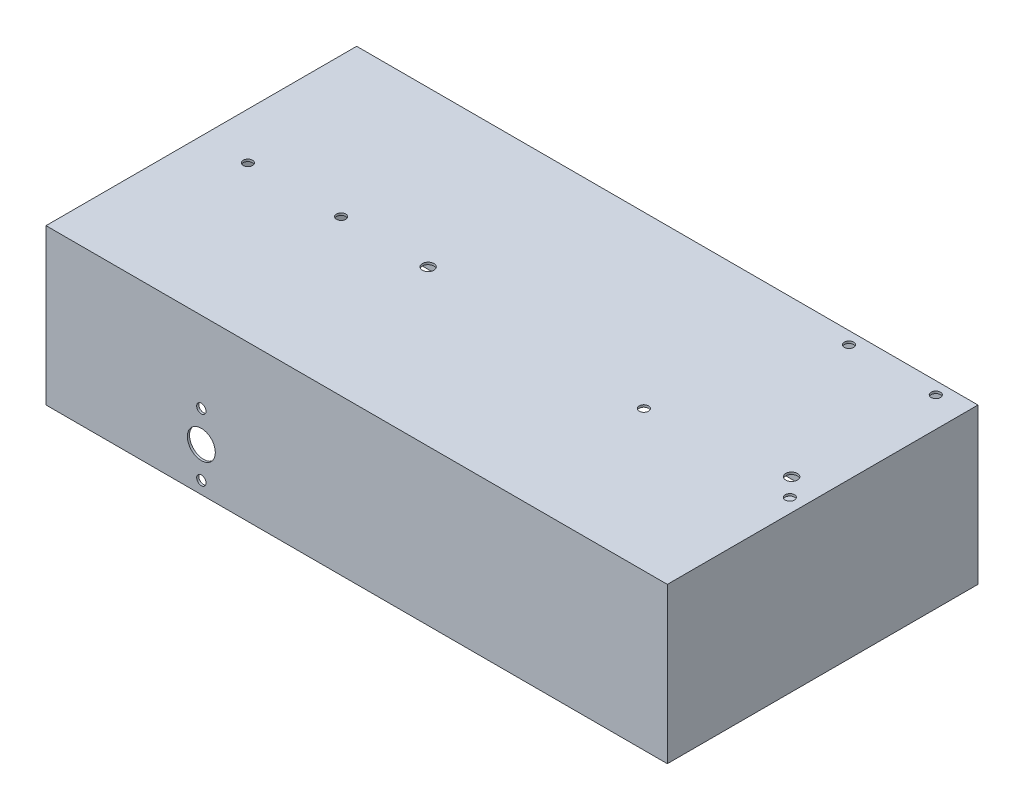
ISO-10303-21;
HEADER;
FILE_DESCRIPTION(('STEP AP214'),'2;1');
FILE_NAME('part.step','',(''),(''),'','','');
FILE_SCHEMA(('AUTOMOTIVE_DESIGN { 1 0 10303 214 1 1 1 1 }'));
ENDSEC;
DATA;
#1=APPLICATION_CONTEXT('core data for automotive mechanical design processes');
#2=APPLICATION_PROTOCOL_DEFINITION('international standard','automotive_design',2000,#1);
#3=PRODUCT_CONTEXT('',#1,'mechanical');
#4=PRODUCT('Part','Part','',(#3));
#5=PRODUCT_RELATED_PRODUCT_CATEGORY('part','',(#4));
#6=PRODUCT_DEFINITION_FORMATION('','',#4);
#7=PRODUCT_DEFINITION_CONTEXT('part definition',#1,'design');
#8=PRODUCT_DEFINITION('design','',#6,#7);
#9=PRODUCT_DEFINITION_SHAPE('','',#8);
#10=(LENGTH_UNIT() NAMED_UNIT(*) SI_UNIT(.MILLI.,.METRE.));
#11=(NAMED_UNIT(*) PLANE_ANGLE_UNIT() SI_UNIT($,.RADIAN.));
#12=(NAMED_UNIT(*) SI_UNIT($,.STERADIAN.) SOLID_ANGLE_UNIT());
#13=UNCERTAINTY_MEASURE_WITH_UNIT(LENGTH_MEASURE(1.E-05),#10,'distance_accuracy_value','');
#14=(GEOMETRIC_REPRESENTATION_CONTEXT(3) GLOBAL_UNCERTAINTY_ASSIGNED_CONTEXT((#13)) GLOBAL_UNIT_ASSIGNED_CONTEXT((#10,
#11,#12)) REPRESENTATION_CONTEXT('',''));
#15=CARTESIAN_POINT('',(0.,0.,0.));
#16=DIRECTION('',(0.,0.,1.));
#17=DIRECTION('',(1.,0.,0.));
#18=AXIS2_PLACEMENT_3D('',#15,#16,#17);
#19=CARTESIAN_POINT('',(0.,50.,-50.));
#20=DIRECTION('',(1.,0.,0.));
#21=DIRECTION('',(0.,0.,-1.));
#22=AXIS2_PLACEMENT_3D('',#19,#20,#21);
#23=PLANE('',#22);
#24=DIRECTION('',(0.,0.,1.));
#25=VECTOR('',#24,1.);
#26=CARTESIAN_POINT('',(0.,0.,-50.));
#27=LINE('',#26,#25);
#28=CARTESIAN_POINT('',(0.,0.,-50.));
#29=VERTEX_POINT('',#28);
#30=CARTESIAN_POINT('',(0.,0.,50.));
#31=VERTEX_POINT('',#30);
#32=EDGE_CURVE('E176',#29,#31,#27,.T.);
#33=ORIENTED_EDGE('',*,*,#32,.T.);
#34=DIRECTION('',(0.,-1.,0.));
#35=VECTOR('',#34,1.);
#36=CARTESIAN_POINT('',(0.,50.,50.));
#37=LINE('',#36,#35);
#38=CARTESIAN_POINT('',(0.,50.,50.));
#39=VERTEX_POINT('',#38);
#40=EDGE_CURVE('E12',#39,#31,#37,.T.);
#41=ORIENTED_EDGE('',*,*,#40,.F.);
#42=DIRECTION('',(0.,0.,1.));
#43=VECTOR('',#42,1.);
#44=CARTESIAN_POINT('',(0.,50.,-50.));
#45=LINE('',#44,#43);
#46=CARTESIAN_POINT('',(0.,50.,-50.));
#47=VERTEX_POINT('',#46);
#48=EDGE_CURVE('E177',#47,#39,#45,.T.);
#49=ORIENTED_EDGE('',*,*,#48,.F.);
#50=DIRECTION('',(0.,-1.,0.));
#51=VECTOR('',#50,1.);
#52=CARTESIAN_POINT('',(0.,50.,-50.));
#53=LINE('',#52,#51);
#54=EDGE_CURVE('E187',#47,#29,#53,.T.);
#55=ORIENTED_EDGE('',*,*,#54,.T.);
#56=EDGE_LOOP('',(#33,#41,#49,#55));
#57=FACE_BOUND('',#56,.T.);
#58=ADVANCED_FACE('F42',(#57),#23,.F.);
#59=CARTESIAN_POINT('',(0.,50.,50.));
#60=DIRECTION('',(0.,0.,-1.));
#61=DIRECTION('',(-1.,0.,0.));
#62=AXIS2_PLACEMENT_3D('',#59,#60,#61);
#63=PLANE('',#62);
#64=CARTESIAN_POINT('',(50.,4.,50.));
#65=DIRECTION('',(0.,0.,1.));
#66=DIRECTION('',(1.,0.,0.));
#67=AXIS2_PLACEMENT_3D('',#64,#65,#66);
#68=CIRCLE('',#67,1.5);
#69=CARTESIAN_POINT('',(51.5,4.,50.));
#70=VERTEX_POINT('',#69);
#71=EDGE_CURVE('E256',#70,#70,#68,.T.);
#72=ORIENTED_EDGE('',*,*,#71,.F.);
#73=EDGE_LOOP('',(#72));
#74=FACE_BOUND('',#73,.T.);
#75=CARTESIAN_POINT('',(50.,24.,50.));
#76=DIRECTION('',(0.,0.,1.));
#77=DIRECTION('',(1.,0.,0.));
#78=AXIS2_PLACEMENT_3D('',#75,#76,#77);
#79=CIRCLE('',#78,1.5);
#80=CARTESIAN_POINT('',(51.5,24.,50.));
#81=VERTEX_POINT('',#80);
#82=EDGE_CURVE('E262',#81,#81,#79,.T.);
#83=ORIENTED_EDGE('',*,*,#82,.F.);
#84=EDGE_LOOP('',(#83));
#85=FACE_BOUND('',#84,.T.);
#86=CARTESIAN_POINT('',(50.,14.,50.));
#87=DIRECTION('',(0.,0.,1.));
#88=DIRECTION('',(1.,0.,0.));
#89=AXIS2_PLACEMENT_3D('',#86,#87,#88);
#90=CIRCLE('',#89,4.5);
#91=CARTESIAN_POINT('',(54.5,14.,50.));
#92=VERTEX_POINT('',#91);
#93=EDGE_CURVE('E219',#92,#92,#90,.T.);
#94=ORIENTED_EDGE('',*,*,#93,.F.);
#95=EDGE_LOOP('',(#94));
#96=FACE_BOUND('',#95,.T.);
#97=DIRECTION('',(1.,0.,0.));
#98=VECTOR('',#97,1.);
#99=CARTESIAN_POINT('',(0.,0.,50.));
#100=LINE('',#99,#98);
#101=CARTESIAN_POINT('',(200.,0.,50.));
#102=VERTEX_POINT('',#101);
#103=EDGE_CURVE('E190',#31,#102,#100,.T.);
#104=ORIENTED_EDGE('',*,*,#103,.T.);
#105=DIRECTION('',(0.,-1.,0.));
#106=VECTOR('',#105,1.);
#107=CARTESIAN_POINT('',(200.,50.,50.));
#108=LINE('',#107,#106);
#109=CARTESIAN_POINT('',(200.,50.,50.));
#110=VERTEX_POINT('',#109);
#111=EDGE_CURVE('E50',#110,#102,#108,.T.);
#112=ORIENTED_EDGE('',*,*,#111,.F.);
#113=DIRECTION('',(1.,0.,0.));
#114=VECTOR('',#113,1.);
#115=CARTESIAN_POINT('',(0.,50.,50.));
#116=LINE('',#115,#114);
#117=EDGE_CURVE('E180',#39,#110,#116,.T.);
#118=ORIENTED_EDGE('',*,*,#117,.F.);
#119=ORIENTED_EDGE('',*,*,#40,.T.);
#120=EDGE_LOOP('',(#104,#112,#118,#119));
#121=FACE_BOUND('',#120,.T.);
#122=ADVANCED_FACE('F300',(#74,#85,#96,#121),#63,.F.);
#123=CARTESIAN_POINT('',(200.,50.,-50.));
#124=DIRECTION('',(-1.,0.,0.));
#125=DIRECTION('',(0.,0.,1.));
#126=AXIS2_PLACEMENT_3D('',#123,#124,#125);
#127=PLANE('',#126);
#128=DIRECTION('',(0.,0.,-1.));
#129=VECTOR('',#128,1.);
#130=CARTESIAN_POINT('',(200.,0.,-50.));
#131=LINE('',#130,#129);
#132=CARTESIAN_POINT('',(200.,0.,-50.));
#133=VERTEX_POINT('',#132);
#134=EDGE_CURVE('E192',#102,#133,#131,.T.);
#135=ORIENTED_EDGE('',*,*,#134,.T.);
#136=DIRECTION('',(0.,-1.,0.));
#137=VECTOR('',#136,1.);
#138=CARTESIAN_POINT('',(200.,50.,-50.));
#139=LINE('',#138,#137);
#140=CARTESIAN_POINT('',(200.,50.,-50.));
#141=VERTEX_POINT('',#140);
#142=EDGE_CURVE('E197',#141,#133,#139,.T.);
#143=ORIENTED_EDGE('',*,*,#142,.F.);
#144=DIRECTION('',(0.,0.,-1.));
#145=VECTOR('',#144,1.);
#146=CARTESIAN_POINT('',(200.,50.,-50.));
#147=LINE('',#146,#145);
#148=EDGE_CURVE('E183',#110,#141,#147,.T.);
#149=ORIENTED_EDGE('',*,*,#148,.F.);
#150=ORIENTED_EDGE('',*,*,#111,.T.);
#151=EDGE_LOOP('',(#135,#143,#149,#150));
#152=FACE_BOUND('',#151,.T.);
#153=ADVANCED_FACE('F305',(#152),#127,.F.);
#154=CARTESIAN_POINT('',(0.,50.,-50.));
#155=DIRECTION('',(0.,0.,1.));
#156=DIRECTION('',(1.,0.,0.));
#157=AXIS2_PLACEMENT_3D('',#154,#155,#156);
#158=PLANE('',#157);
#159=CARTESIAN_POINT('',(50.,4.,-50.));
#160=DIRECTION('',(0.,0.,1.));
#161=DIRECTION('',(1.,0.,0.));
#162=AXIS2_PLACEMENT_3D('',#159,#160,#161);
#163=CIRCLE('',#162,1.5);
#164=CARTESIAN_POINT('',(51.5,4.,-50.));
#165=VERTEX_POINT('',#164);
#166=EDGE_CURVE('E206',#165,#165,#163,.T.);
#167=ORIENTED_EDGE('',*,*,#166,.T.);
#168=EDGE_LOOP('',(#167));
#169=FACE_BOUND('',#168,.T.);
#170=CARTESIAN_POINT('',(50.,24.,-50.));
#171=DIRECTION('',(0.,0.,1.));
#172=DIRECTION('',(1.,0.,0.));
#173=AXIS2_PLACEMENT_3D('',#170,#171,#172);
#174=CIRCLE('',#173,1.5);
#175=CARTESIAN_POINT('',(51.5,24.,-50.));
#176=VERTEX_POINT('',#175);
#177=EDGE_CURVE('E259',#176,#176,#174,.T.);
#178=ORIENTED_EDGE('',*,*,#177,.T.);
#179=EDGE_LOOP('',(#178));
#180=FACE_BOUND('',#179,.T.);
#181=CARTESIAN_POINT('',(50.,14.,-50.));
#182=DIRECTION('',(0.,0.,1.));
#183=DIRECTION('',(1.,0.,0.));
#184=AXIS2_PLACEMENT_3D('',#181,#182,#183);
#185=CIRCLE('',#184,4.5);
#186=CARTESIAN_POINT('',(54.5,14.,-50.));
#187=VERTEX_POINT('',#186);
#188=EDGE_CURVE('E265',#187,#187,#185,.T.);
#189=ORIENTED_EDGE('',*,*,#188,.T.);
#190=EDGE_LOOP('',(#189));
#191=FACE_BOUND('',#190,.T.);
#192=DIRECTION('',(-1.,0.,0.));
#193=VECTOR('',#192,1.);
#194=CARTESIAN_POINT('',(0.,0.,-50.));
#195=LINE('',#194,#193);
#196=EDGE_CURVE('E181',#133,#29,#195,.T.);
#197=ORIENTED_EDGE('',*,*,#196,.T.);
#198=ORIENTED_EDGE('',*,*,#54,.F.);
#199=DIRECTION('',(-1.,0.,0.));
#200=VECTOR('',#199,1.);
#201=CARTESIAN_POINT('',(0.,50.,-50.));
#202=LINE('',#201,#200);
#203=EDGE_CURVE('E185',#141,#47,#202,.T.);
#204=ORIENTED_EDGE('',*,*,#203,.F.);
#205=ORIENTED_EDGE('',*,*,#142,.T.);
#206=EDGE_LOOP('',(#197,#198,#204,#205));
#207=FACE_BOUND('',#206,.T.);
#208=ADVANCED_FACE('F321',(#169,#180,#191,#207),#158,.F.);
#209=CARTESIAN_POINT('',(0.,50.,0.));
#210=DIRECTION('',(0.,1.,0.));
#211=DIRECTION('',(0.,0.,1.));
#212=AXIS2_PLACEMENT_3D('',#209,#210,#211);
#213=PLANE('',#212);
#214=CARTESIAN_POINT('',(162.44,50.,-46.04));
#215=DIRECTION('',(0.,1.,0.));
#216=DIRECTION('',(0.,0.,1.));
#217=AXIS2_PLACEMENT_3D('',#214,#215,#216);
#218=CIRCLE('',#217,1.5);
#219=CARTESIAN_POINT('',(162.44,50.,-44.54));
#220=VERTEX_POINT('',#219);
#221=EDGE_CURVE('E342',#220,#220,#218,.T.);
#222=ORIENTED_EDGE('',*,*,#221,.F.);
#223=EDGE_LOOP('',(#222));
#224=FACE_BOUND('',#223,.T.);
#225=CARTESIAN_POINT('',(147.2,50.,4.75999999999999));
#226=DIRECTION('',(0.,1.,0.));
#227=DIRECTION('',(0.,0.,1.));
#228=AXIS2_PLACEMENT_3D('',#225,#226,#227);
#229=CIRCLE('',#228,1.5);
#230=CARTESIAN_POINT('',(147.2,50.,6.25999999999998));
#231=VERTEX_POINT('',#230);
#232=EDGE_CURVE('E346',#231,#231,#229,.T.);
#233=ORIENTED_EDGE('',*,*,#232,.F.);
#234=EDGE_LOOP('',(#233));
#235=FACE_BOUND('',#234,.T.);
#236=CARTESIAN_POINT('',(195.46,50.,6.02999999999998));
#237=DIRECTION('',(0.,1.,0.));
#238=DIRECTION('',(0.,0.,1.));
#239=AXIS2_PLACEMENT_3D('',#236,#237,#238);
#240=CIRCLE('',#239,1.5);
#241=CARTESIAN_POINT('',(195.46,50.,7.52999999999998));
#242=VERTEX_POINT('',#241);
#243=EDGE_CURVE('E350',#242,#242,#240,.T.);
#244=ORIENTED_EDGE('',*,*,#243,.F.);
#245=EDGE_LOOP('',(#244));
#246=FACE_BOUND('',#245,.T.);
#247=CARTESIAN_POINT('',(190.38,50.,-46.04));
#248=DIRECTION('',(0.,1.,0.));
#249=DIRECTION('',(0.,0.,1.));
#250=AXIS2_PLACEMENT_3D('',#247,#248,#249);
#251=CIRCLE('',#250,1.5);
#252=CARTESIAN_POINT('',(190.38,50.,-44.54));
#253=VERTEX_POINT('',#252);
#254=EDGE_CURVE('E354',#253,#253,#251,.T.);
#255=ORIENTED_EDGE('',*,*,#254,.F.);
#256=EDGE_LOOP('',(#255));
#257=FACE_BOUND('',#256,.T.);
#258=CARTESIAN_POINT('',(15.,50.,0.));
#259=DIRECTION('',(0.,1.,0.));
#260=DIRECTION('',(0.,0.,1.));
#261=AXIS2_PLACEMENT_3D('',#258,#259,#260);
#262=CIRCLE('',#261,1.5);
#263=CARTESIAN_POINT('',(15.,50.,1.5));
#264=VERTEX_POINT('',#263);
#265=EDGE_CURVE('E222',#264,#264,#262,.T.);
#266=ORIENTED_EDGE('',*,*,#265,.F.);
#267=EDGE_LOOP('',(#266));
#268=FACE_BOUND('',#267,.T.);
#269=CARTESIAN_POINT('',(45.,50.,0.));
#270=DIRECTION('',(0.,1.,0.));
#271=DIRECTION('',(0.,0.,1.));
#272=AXIS2_PLACEMENT_3D('',#269,#270,#271);
#273=CIRCLE('',#272,1.5);
#274=CARTESIAN_POINT('',(45.,50.,1.5));
#275=VERTEX_POINT('',#274);
#276=EDGE_CURVE('E228',#275,#275,#273,.T.);
#277=ORIENTED_EDGE('',*,*,#276,.F.);
#278=EDGE_LOOP('',(#277));
#279=FACE_BOUND('',#278,.T.);
#280=CARTESIAN_POINT('',(190.,50.,0.));
#281=DIRECTION('',(0.,1.,0.));
#282=DIRECTION('',(0.,0.,1.));
#283=AXIS2_PLACEMENT_3D('',#280,#281,#282);
#284=CIRCLE('',#283,1.87);
#285=CARTESIAN_POINT('',(190.,50.,1.87));
#286=VERTEX_POINT('',#285);
#287=EDGE_CURVE('E241',#286,#286,#284,.F.);
#288=ORIENTED_EDGE('',*,*,#287,.T.);
#289=EDGE_LOOP('',(#288));
#290=FACE_BOUND('',#289,.T.);
#291=CARTESIAN_POINT('',(73.,50.,0.));
#292=DIRECTION('',(0.,1.,0.));
#293=DIRECTION('',(0.,0.,1.));
#294=AXIS2_PLACEMENT_3D('',#291,#292,#293);
#295=CIRCLE('',#294,1.87);
#296=CARTESIAN_POINT('',(73.,50.,1.87));
#297=VERTEX_POINT('',#296);
#298=EDGE_CURVE('E226',#297,#297,#295,.F.);
#299=ORIENTED_EDGE('',*,*,#298,.T.);
#300=EDGE_LOOP('',(#299));
#301=FACE_BOUND('',#300,.T.);
#302=ORIENTED_EDGE('',*,*,#48,.T.);
#303=ORIENTED_EDGE('',*,*,#117,.T.);
#304=ORIENTED_EDGE('',*,*,#148,.T.);
#305=ORIENTED_EDGE('',*,*,#203,.T.);
#306=EDGE_LOOP('',(#302,#303,#304,#305));
#307=FACE_BOUND('',#306,.T.);
#308=ADVANCED_FACE('F317',(#224,#235,#246,#257,#268,#279,#290,#301,#307),#213,.T.);
#309=CARTESIAN_POINT('',(0.,0.,0.));
#310=DIRECTION('',(0.,1.,0.));
#311=DIRECTION('',(0.,0.,1.));
#312=AXIS2_PLACEMENT_3D('',#309,#310,#311);
#313=PLANE('',#312);
#314=CARTESIAN_POINT('',(160.,0.,-7.05));
#315=DIRECTION('',(0.,-1.,0.));
#316=DIRECTION('',(0.,0.,-1.));
#317=AXIS2_PLACEMENT_3D('',#314,#315,#316);
#318=CIRCLE('',#317,1.21);
#319=CARTESIAN_POINT('',(160.,0.,-8.26));
#320=VERTEX_POINT('',#319);
#321=EDGE_CURVE('E217',#320,#320,#318,.T.);
#322=ORIENTED_EDGE('',*,*,#321,.F.);
#323=EDGE_LOOP('',(#322));
#324=FACE_BOUND('',#323,.T.);
#325=CARTESIAN_POINT('',(160.,0.,8.45));
#326=DIRECTION('',(0.,-1.,0.));
#327=DIRECTION('',(0.,0.,-1.));
#328=AXIS2_PLACEMENT_3D('',#325,#326,#327);
#329=CIRCLE('',#328,1.21);
#330=CARTESIAN_POINT('',(160.,0.,7.24));
#331=VERTEX_POINT('',#330);
#332=EDGE_CURVE('E245',#331,#331,#329,.T.);
#333=ORIENTED_EDGE('',*,*,#332,.F.);
#334=EDGE_LOOP('',(#333));
#335=FACE_BOUND('',#334,.T.);
#336=DIRECTION('',(1.,0.,0.));
#337=VECTOR('',#336,1.);
#338=CARTESIAN_POINT('',(0.700000000000012,0.,-49.3));
#339=LINE('',#338,#337);
#340=CARTESIAN_POINT('',(0.700000000000012,0.,-49.3));
#341=VERTEX_POINT('',#340);
#342=CARTESIAN_POINT('',(145.,0.,-49.3));
#343=VERTEX_POINT('',#342);
#344=EDGE_CURVE('E63',#341,#343,#339,.T.);
#345=ORIENTED_EDGE('',*,*,#344,.F.);
#346=DIRECTION('',(0.,0.,-1.));
#347=VECTOR('',#346,1.);
#348=CARTESIAN_POINT('',(0.7,0.,49.3));
#349=LINE('',#348,#347);
#350=CARTESIAN_POINT('',(0.7,0.,49.3));
#351=VERTEX_POINT('',#350);
#352=EDGE_CURVE('E125',#351,#341,#349,.T.);
#353=ORIENTED_EDGE('',*,*,#352,.F.);
#354=DIRECTION('',(-1.,0.,0.));
#355=VECTOR('',#354,1.);
#356=CARTESIAN_POINT('',(199.3,0.,49.3));
#357=LINE('',#356,#355);
#358=CARTESIAN_POINT('',(145.,0.,49.3));
#359=VERTEX_POINT('',#358);
#360=EDGE_CURVE('E118',#359,#351,#357,.T.);
#361=ORIENTED_EDGE('',*,*,#360,.F.);
#362=DIRECTION('',(0.,0.,-1.));
#363=VECTOR('',#362,1.);
#364=CARTESIAN_POINT('',(145.,0.,-49.3));
#365=LINE('',#364,#363);
#366=EDGE_CURVE('E123',#359,#343,#365,.T.);
#367=ORIENTED_EDGE('',*,*,#366,.T.);
#368=EDGE_LOOP('',(#345,#353,#361,#367));
#369=FACE_BOUND('',#368,.T.);
#370=ORIENTED_EDGE('',*,*,#32,.F.);
#371=ORIENTED_EDGE('',*,*,#196,.F.);
#372=ORIENTED_EDGE('',*,*,#134,.F.);
#373=ORIENTED_EDGE('',*,*,#103,.F.);
#374=EDGE_LOOP('',(#370,#371,#372,#373));
#375=FACE_BOUND('',#374,.T.);
#376=ADVANCED_FACE('F120',(#324,#335,#369,#375),#313,.F.);
#377=CARTESIAN_POINT('',(0.,49.3,0.));
#378=DIRECTION('',(0.,1.,0.));
#379=DIRECTION('',(0.,0.,1.));
#380=AXIS2_PLACEMENT_3D('',#377,#378,#379);
#381=PLANE('',#380);
#382=CARTESIAN_POINT('',(162.44,49.3,-46.04));
#383=DIRECTION('',(0.,1.,0.));
#384=DIRECTION('',(0.,0.,1.));
#385=AXIS2_PLACEMENT_3D('',#382,#383,#384);
#386=CIRCLE('',#385,1.5);
#387=CARTESIAN_POINT('',(162.44,49.3,-44.54));
#388=VERTEX_POINT('',#387);
#389=EDGE_CURVE('E536',#388,#388,#386,.F.);
#390=ORIENTED_EDGE('',*,*,#389,.F.);
#391=EDGE_LOOP('',(#390));
#392=FACE_BOUND('',#391,.T.);
#393=CARTESIAN_POINT('',(147.2,49.3,4.75999999999999));
#394=DIRECTION('',(0.,1.,0.));
#395=DIRECTION('',(0.,0.,1.));
#396=AXIS2_PLACEMENT_3D('',#393,#394,#395);
#397=CIRCLE('',#396,1.5);
#398=CARTESIAN_POINT('',(147.2,49.3,6.25999999999998));
#399=VERTEX_POINT('',#398);
#400=EDGE_CURVE('E540',#399,#399,#397,.F.);
#401=ORIENTED_EDGE('',*,*,#400,.F.);
#402=EDGE_LOOP('',(#401));
#403=FACE_BOUND('',#402,.T.);
#404=CARTESIAN_POINT('',(195.46,49.3,6.02999999999998));
#405=DIRECTION('',(0.,1.,0.));
#406=DIRECTION('',(0.,0.,1.));
#407=AXIS2_PLACEMENT_3D('',#404,#405,#406);
#408=CIRCLE('',#407,1.5);
#409=CARTESIAN_POINT('',(195.46,49.3,7.52999999999998));
#410=VERTEX_POINT('',#409);
#411=EDGE_CURVE('E542',#410,#410,#408,.F.);
#412=ORIENTED_EDGE('',*,*,#411,.F.);
#413=EDGE_LOOP('',(#412));
#414=FACE_BOUND('',#413,.T.);
#415=CARTESIAN_POINT('',(190.38,49.3,-46.04));
#416=DIRECTION('',(0.,1.,0.));
#417=DIRECTION('',(0.,0.,1.));
#418=AXIS2_PLACEMENT_3D('',#415,#416,#417);
#419=CIRCLE('',#418,1.5);
#420=CARTESIAN_POINT('',(190.38,49.3,-44.54));
#421=VERTEX_POINT('',#420);
#422=EDGE_CURVE('E233',#421,#421,#419,.F.);
#423=ORIENTED_EDGE('',*,*,#422,.F.);
#424=EDGE_LOOP('',(#423));
#425=FACE_BOUND('',#424,.T.);
#426=CARTESIAN_POINT('',(15.,49.3,0.));
#427=DIRECTION('',(0.,1.,0.));
#428=DIRECTION('',(0.,0.,1.));
#429=AXIS2_PLACEMENT_3D('',#426,#427,#428);
#430=CIRCLE('',#429,1.5);
#431=CARTESIAN_POINT('',(15.,49.3,1.5));
#432=VERTEX_POINT('',#431);
#433=EDGE_CURVE('E45',#432,#432,#430,.T.);
#434=ORIENTED_EDGE('',*,*,#433,.T.);
#435=EDGE_LOOP('',(#434));
#436=FACE_BOUND('',#435,.T.);
#437=CARTESIAN_POINT('',(45.,49.3,0.));
#438=DIRECTION('',(0.,1.,0.));
#439=DIRECTION('',(0.,0.,1.));
#440=AXIS2_PLACEMENT_3D('',#437,#438,#439);
#441=CIRCLE('',#440,1.5);
#442=CARTESIAN_POINT('',(45.,49.3,1.5));
#443=VERTEX_POINT('',#442);
#444=EDGE_CURVE('E220',#443,#443,#441,.T.);
#445=ORIENTED_EDGE('',*,*,#444,.T.);
#446=EDGE_LOOP('',(#445));
#447=FACE_BOUND('',#446,.T.);
#448=CARTESIAN_POINT('',(190.,49.3,0.));
#449=DIRECTION('',(0.,-1.,0.));
#450=DIRECTION('',(0.,0.,-1.));
#451=AXIS2_PLACEMENT_3D('',#448,#449,#450);
#452=CIRCLE('',#451,1.87);
#453=CARTESIAN_POINT('',(190.,49.3,-1.87));
#454=VERTEX_POINT('',#453);
#455=EDGE_CURVE('E238',#454,#454,#452,.T.);
#456=ORIENTED_EDGE('',*,*,#455,.F.);
#457=EDGE_LOOP('',(#456));
#458=FACE_BOUND('',#457,.T.);
#459=CARTESIAN_POINT('',(73.,49.3,0.));
#460=DIRECTION('',(0.,-1.,0.));
#461=DIRECTION('',(0.,0.,-1.));
#462=AXIS2_PLACEMENT_3D('',#459,#460,#461);
#463=CIRCLE('',#462,1.87);
#464=CARTESIAN_POINT('',(73.,49.3,-1.87));
#465=VERTEX_POINT('',#464);
#466=EDGE_CURVE('E242',#465,#465,#463,.T.);
#467=ORIENTED_EDGE('',*,*,#466,.F.);
#468=EDGE_LOOP('',(#467));
#469=FACE_BOUND('',#468,.T.);
#470=DIRECTION('',(-1.,0.,0.));
#471=VECTOR('',#470,1.);
#472=CARTESIAN_POINT('',(199.3,49.3,49.3));
#473=LINE('',#472,#471);
#474=CARTESIAN_POINT('',(199.3,49.3,49.3));
#475=VERTEX_POINT('',#474);
#476=CARTESIAN_POINT('',(0.7,49.3,49.3));
#477=VERTEX_POINT('',#476);
#478=EDGE_CURVE('E159',#475,#477,#473,.T.);
#479=ORIENTED_EDGE('',*,*,#478,.T.);
#480=DIRECTION('',(0.,0.,-1.));
#481=VECTOR('',#480,1.);
#482=CARTESIAN_POINT('',(0.7,49.3,49.3));
#483=LINE('',#482,#481);
#484=CARTESIAN_POINT('',(0.700000000000012,49.3,-49.3));
#485=VERTEX_POINT('',#484);
#486=EDGE_CURVE('E154',#477,#485,#483,.T.);
#487=ORIENTED_EDGE('',*,*,#486,.T.);
#488=DIRECTION('',(1.,0.,0.));
#489=VECTOR('',#488,1.);
#490=CARTESIAN_POINT('',(0.700000000000012,49.3,-49.3));
#491=LINE('',#490,#489);
#492=CARTESIAN_POINT('',(199.3,49.3,-49.3));
#493=VERTEX_POINT('',#492);
#494=EDGE_CURVE('E168',#485,#493,#491,.T.);
#495=ORIENTED_EDGE('',*,*,#494,.T.);
#496=DIRECTION('',(0.,0.,1.));
#497=VECTOR('',#496,1.);
#498=CARTESIAN_POINT('',(199.3,49.3,-49.3));
#499=LINE('',#498,#497);
#500=EDGE_CURVE('E164',#493,#475,#499,.T.);
#501=ORIENTED_EDGE('',*,*,#500,.T.);
#502=EDGE_LOOP('',(#479,#487,#495,#501));
#503=FACE_BOUND('',#502,.T.);
#504=ADVANCED_FACE('F285',(#392,#403,#414,#425,#436,#447,#458,#469,#503),#381,.F.);
#505=CARTESIAN_POINT('',(0.7,271.729384611061,49.3));
#506=DIRECTION('',(-1.,0.,0.));
#507=DIRECTION('',(0.,0.,1.));
#508=AXIS2_PLACEMENT_3D('',#505,#506,#507);
#509=PLANE('',#508);
#510=DIRECTION('',(0.,-1.,0.));
#511=VECTOR('',#510,1.);
#512=CARTESIAN_POINT('',(0.7,271.729384611061,49.3));
#513=LINE('',#512,#511);
#514=EDGE_CURVE('E162',#477,#351,#513,.T.);
#515=ORIENTED_EDGE('',*,*,#514,.T.);
#516=ORIENTED_EDGE('',*,*,#352,.T.);
#517=DIRECTION('',(0.,-1.,0.));
#518=VECTOR('',#517,1.);
#519=CARTESIAN_POINT('',(0.700000000000012,271.729384611061,-49.3));
#520=LINE('',#519,#518);
#521=EDGE_CURVE('E158',#485,#341,#520,.T.);
#522=ORIENTED_EDGE('',*,*,#521,.F.);
#523=ORIENTED_EDGE('',*,*,#486,.F.);
#524=EDGE_LOOP('',(#515,#516,#522,#523));
#525=FACE_BOUND('',#524,.T.);
#526=ADVANCED_FACE('F287',(#525),#509,.F.);
#527=CARTESIAN_POINT('',(0.700000000000012,271.729384611061,-49.3));
#528=DIRECTION('',(0.,0.,-1.));
#529=DIRECTION('',(-1.,0.,0.));
#530=AXIS2_PLACEMENT_3D('',#527,#528,#529);
#531=PLANE('',#530);
#532=CARTESIAN_POINT('',(50.,4.,-49.3));
#533=DIRECTION('',(0.,0.,-1.));
#534=DIRECTION('',(-1.,0.,0.));
#535=AXIS2_PLACEMENT_3D('',#532,#533,#534);
#536=CIRCLE('',#535,1.5);
#537=CARTESIAN_POINT('',(48.5,4.,-49.3));
#538=VERTEX_POINT('',#537);
#539=EDGE_CURVE('E142',#538,#538,#536,.T.);
#540=ORIENTED_EDGE('',*,*,#539,.T.);
#541=EDGE_LOOP('',(#540));
#542=FACE_BOUND('',#541,.T.);
#543=CARTESIAN_POINT('',(50.,24.,-49.3));
#544=DIRECTION('',(0.,0.,-1.));
#545=DIRECTION('',(-1.,0.,0.));
#546=AXIS2_PLACEMENT_3D('',#543,#544,#545);
#547=CIRCLE('',#546,1.5);
#548=CARTESIAN_POINT('',(48.5,24.,-49.3));
#549=VERTEX_POINT('',#548);
#550=EDGE_CURVE('E210',#549,#549,#547,.T.);
#551=ORIENTED_EDGE('',*,*,#550,.T.);
#552=EDGE_LOOP('',(#551));
#553=FACE_BOUND('',#552,.T.);
#554=CARTESIAN_POINT('',(50.,14.,-49.3));
#555=DIRECTION('',(0.,0.,-1.));
#556=DIRECTION('',(-1.,0.,0.));
#557=AXIS2_PLACEMENT_3D('',#554,#555,#556);
#558=CIRCLE('',#557,4.5);
#559=CARTESIAN_POINT('',(45.5,14.,-49.3));
#560=VERTEX_POINT('',#559);
#561=EDGE_CURVE('E205',#560,#560,#558,.T.);
#562=ORIENTED_EDGE('',*,*,#561,.T.);
#563=EDGE_LOOP('',(#562));
#564=FACE_BOUND('',#563,.T.);
#565=ORIENTED_EDGE('',*,*,#344,.T.);
#566=DIRECTION('',(0.,-1.,0.));
#567=VECTOR('',#566,1.);
#568=CARTESIAN_POINT('',(145.,0.7,-49.3));
#569=LINE('',#568,#567);
#570=CARTESIAN_POINT('',(145.,0.699999999999978,-49.3));
#571=VERTEX_POINT('',#570);
#572=EDGE_CURVE('E58',#571,#343,#569,.T.);
#573=ORIENTED_EDGE('',*,*,#572,.F.);
#574=DIRECTION('',(1.,0.,0.));
#575=VECTOR('',#574,1.);
#576=CARTESIAN_POINT('',(145.,0.7,-49.3));
#577=LINE('',#576,#575);
#578=CARTESIAN_POINT('',(199.3,0.699999999999978,-49.3));
#579=VERTEX_POINT('',#578);
#580=EDGE_CURVE('E144',#571,#579,#577,.T.);
#581=ORIENTED_EDGE('',*,*,#580,.T.);
#582=DIRECTION('',(0.,-1.,0.));
#583=VECTOR('',#582,1.);
#584=CARTESIAN_POINT('',(199.3,271.729384611061,-49.3));
#585=LINE('',#584,#583);
#586=EDGE_CURVE('E167',#493,#579,#585,.T.);
#587=ORIENTED_EDGE('',*,*,#586,.F.);
#588=ORIENTED_EDGE('',*,*,#494,.F.);
#589=ORIENTED_EDGE('',*,*,#521,.T.);
#590=EDGE_LOOP('',(#565,#573,#581,#587,#588,#589));
#591=FACE_BOUND('',#590,.T.);
#592=ADVANCED_FACE('F282',(#542,#553,#564,#591),#531,.F.);
#593=CARTESIAN_POINT('',(199.3,271.729384611061,-49.3));
#594=DIRECTION('',(1.,0.,0.));
#595=DIRECTION('',(0.,0.,-1.));
#596=AXIS2_PLACEMENT_3D('',#593,#594,#595);
#597=PLANE('',#596);
#598=ORIENTED_EDGE('',*,*,#586,.T.);
#599=DIRECTION('',(0.,0.,1.));
#600=VECTOR('',#599,1.);
#601=CARTESIAN_POINT('',(199.3,0.7,-49.3));
#602=LINE('',#601,#600);
#603=CARTESIAN_POINT('',(199.3,0.699999999999978,49.3));
#604=VERTEX_POINT('',#603);
#605=EDGE_CURVE('E274',#579,#604,#602,.T.);
#606=ORIENTED_EDGE('',*,*,#605,.T.);
#607=DIRECTION('',(0.,-1.,0.));
#608=VECTOR('',#607,1.);
#609=CARTESIAN_POINT('',(199.3,271.729384611061,49.3));
#610=LINE('',#609,#608);
#611=EDGE_CURVE('E163',#475,#604,#610,.T.);
#612=ORIENTED_EDGE('',*,*,#611,.F.);
#613=ORIENTED_EDGE('',*,*,#500,.F.);
#614=EDGE_LOOP('',(#598,#606,#612,#613));
#615=FACE_BOUND('',#614,.T.);
#616=ADVANCED_FACE('F278',(#615),#597,.F.);
#617=CARTESIAN_POINT('',(199.3,271.729384611061,49.3));
#618=DIRECTION('',(0.,0.,1.));
#619=DIRECTION('',(1.,0.,0.));
#620=AXIS2_PLACEMENT_3D('',#617,#618,#619);
#621=PLANE('',#620);
#622=CARTESIAN_POINT('',(50.,4.,49.3));
#623=DIRECTION('',(0.,0.,1.));
#624=DIRECTION('',(1.,0.,0.));
#625=AXIS2_PLACEMENT_3D('',#622,#623,#624);
#626=CIRCLE('',#625,1.5);
#627=CARTESIAN_POINT('',(51.5,4.,49.3));
#628=VERTEX_POINT('',#627);
#629=EDGE_CURVE('E147',#628,#628,#626,.T.);
#630=ORIENTED_EDGE('',*,*,#629,.T.);
#631=EDGE_LOOP('',(#630));
#632=FACE_BOUND('',#631,.T.);
#633=CARTESIAN_POINT('',(50.,24.,49.3));
#634=DIRECTION('',(0.,0.,1.));
#635=DIRECTION('',(1.,0.,0.));
#636=AXIS2_PLACEMENT_3D('',#633,#634,#635);
#637=CIRCLE('',#636,1.5);
#638=CARTESIAN_POINT('',(51.5,24.,49.3));
#639=VERTEX_POINT('',#638);
#640=EDGE_CURVE('E207',#639,#639,#637,.T.);
#641=ORIENTED_EDGE('',*,*,#640,.T.);
#642=EDGE_LOOP('',(#641));
#643=FACE_BOUND('',#642,.T.);
#644=CARTESIAN_POINT('',(50.,14.,49.3));
#645=DIRECTION('',(0.,0.,1.));
#646=DIRECTION('',(1.,0.,0.));
#647=AXIS2_PLACEMENT_3D('',#644,#645,#646);
#648=CIRCLE('',#647,4.5);
#649=CARTESIAN_POINT('',(54.5,14.,49.3));
#650=VERTEX_POINT('',#649);
#651=EDGE_CURVE('E202',#650,#650,#648,.T.);
#652=ORIENTED_EDGE('',*,*,#651,.T.);
#653=EDGE_LOOP('',(#652));
#654=FACE_BOUND('',#653,.T.);
#655=DIRECTION('',(-1.,0.,0.));
#656=VECTOR('',#655,1.);
#657=CARTESIAN_POINT('',(145.,0.7,49.3));
#658=LINE('',#657,#656);
#659=CARTESIAN_POINT('',(145.,0.699999999999978,49.3));
#660=VERTEX_POINT('',#659);
#661=EDGE_CURVE('E135',#604,#660,#658,.T.);
#662=ORIENTED_EDGE('',*,*,#661,.T.);
#663=DIRECTION('',(0.,-1.,0.));
#664=VECTOR('',#663,1.);
#665=CARTESIAN_POINT('',(145.,0.7,49.3));
#666=LINE('',#665,#664);
#667=EDGE_CURVE('E129',#660,#359,#666,.T.);
#668=ORIENTED_EDGE('',*,*,#667,.T.);
#669=ORIENTED_EDGE('',*,*,#360,.T.);
#670=ORIENTED_EDGE('',*,*,#514,.F.);
#671=ORIENTED_EDGE('',*,*,#478,.F.);
#672=ORIENTED_EDGE('',*,*,#611,.T.);
#673=EDGE_LOOP('',(#662,#668,#669,#670,#671,#672));
#674=FACE_BOUND('',#673,.T.);
#675=ADVANCED_FACE('F132',(#632,#643,#654,#674),#621,.F.);
#676=CARTESIAN_POINT('',(145.,0.7,-49.3));
#677=DIRECTION('',(-1.,0.,0.));
#678=DIRECTION('',(0.,0.,1.));
#679=AXIS2_PLACEMENT_3D('',#676,#677,#678);
#680=PLANE('',#679);
#681=ORIENTED_EDGE('',*,*,#366,.F.);
#682=ORIENTED_EDGE('',*,*,#667,.F.);
#683=DIRECTION('',(0.,0.,-1.));
#684=VECTOR('',#683,1.);
#685=CARTESIAN_POINT('',(145.,0.7,-49.3));
#686=LINE('',#685,#684);
#687=EDGE_CURVE('E141',#660,#571,#686,.T.);
#688=ORIENTED_EDGE('',*,*,#687,.T.);
#689=ORIENTED_EDGE('',*,*,#572,.T.);
#690=EDGE_LOOP('',(#681,#682,#688,#689));
#691=FACE_BOUND('',#690,.T.);
#692=ADVANCED_FACE('F140',(#691),#680,.T.);
#693=CARTESIAN_POINT('',(0.,0.7,0.));
#694=DIRECTION('',(0.,1.,0.));
#695=DIRECTION('',(0.,0.,1.));
#696=AXIS2_PLACEMENT_3D('',#693,#694,#695);
#697=PLANE('',#696);
#698=CARTESIAN_POINT('',(160.,0.7,-7.05));
#699=DIRECTION('',(0.,1.,0.));
#700=DIRECTION('',(0.,0.,1.));
#701=AXIS2_PLACEMENT_3D('',#698,#699,#700);
#702=CIRCLE('',#701,1.21);
#703=CARTESIAN_POINT('',(160.,0.7,-5.84000000000001));
#704=VERTEX_POINT('',#703);
#705=EDGE_CURVE('E216',#704,#704,#702,.T.);
#706=ORIENTED_EDGE('',*,*,#705,.F.);
#707=EDGE_LOOP('',(#706));
#708=FACE_BOUND('',#707,.T.);
#709=CARTESIAN_POINT('',(160.,0.7,8.45));
#710=DIRECTION('',(0.,1.,0.));
#711=DIRECTION('',(0.,0.,1.));
#712=AXIS2_PLACEMENT_3D('',#709,#710,#711);
#713=CIRCLE('',#712,1.21);
#714=CARTESIAN_POINT('',(160.,0.7,9.65999999999999));
#715=VERTEX_POINT('',#714);
#716=EDGE_CURVE('E213',#715,#715,#713,.T.);
#717=ORIENTED_EDGE('',*,*,#716,.F.);
#718=EDGE_LOOP('',(#717));
#719=FACE_BOUND('',#718,.T.);
#720=ORIENTED_EDGE('',*,*,#687,.F.);
#721=ORIENTED_EDGE('',*,*,#661,.F.);
#722=ORIENTED_EDGE('',*,*,#605,.F.);
#723=ORIENTED_EDGE('',*,*,#580,.F.);
#724=EDGE_LOOP('',(#720,#721,#722,#723));
#725=FACE_BOUND('',#724,.T.);
#726=ADVANCED_FACE('F281',(#708,#719,#725),#697,.T.);
#727=CARTESIAN_POINT('',(50.,14.,-50.));
#728=DIRECTION('',(0.,0.,1.));
#729=DIRECTION('',(1.,0.,0.));
#730=AXIS2_PLACEMENT_3D('',#727,#728,#729);
#731=CYLINDRICAL_SURFACE('',#730,4.5);
#732=ORIENTED_EDGE('',*,*,#93,.T.);
#733=EDGE_LOOP('',(#732));
#734=FACE_BOUND('',#733,.T.);
#735=ORIENTED_EDGE('',*,*,#651,.F.);
#736=EDGE_LOOP('',(#735));
#737=FACE_BOUND('',#736,.T.);
#738=ADVANCED_FACE('F397',(#734,#737),#731,.F.);
#739=CARTESIAN_POINT('',(50.,24.,-50.));
#740=DIRECTION('',(0.,0.,1.));
#741=DIRECTION('',(1.,0.,0.));
#742=AXIS2_PLACEMENT_3D('',#739,#740,#741);
#743=CYLINDRICAL_SURFACE('',#742,1.5);
#744=ORIENTED_EDGE('',*,*,#82,.T.);
#745=EDGE_LOOP('',(#744));
#746=FACE_BOUND('',#745,.T.);
#747=ORIENTED_EDGE('',*,*,#640,.F.);
#748=EDGE_LOOP('',(#747));
#749=FACE_BOUND('',#748,.T.);
#750=ADVANCED_FACE('F393',(#746,#749),#743,.F.);
#751=CARTESIAN_POINT('',(50.,4.,-50.));
#752=DIRECTION('',(0.,0.,1.));
#753=DIRECTION('',(1.,0.,0.));
#754=AXIS2_PLACEMENT_3D('',#751,#752,#753);
#755=CYLINDRICAL_SURFACE('',#754,1.5);
#756=ORIENTED_EDGE('',*,*,#71,.T.);
#757=EDGE_LOOP('',(#756));
#758=FACE_BOUND('',#757,.T.);
#759=ORIENTED_EDGE('',*,*,#629,.F.);
#760=EDGE_LOOP('',(#759));
#761=FACE_BOUND('',#760,.T.);
#762=ADVANCED_FACE('F388',(#758,#761),#755,.F.);
#763=ORIENTED_EDGE('',*,*,#188,.F.);
#764=EDGE_LOOP('',(#763));
#765=FACE_BOUND('',#764,.T.);
#766=ORIENTED_EDGE('',*,*,#561,.F.);
#767=EDGE_LOOP('',(#766));
#768=FACE_BOUND('',#767,.T.);
#769=ADVANCED_FACE('F391',(#765,#768),#731,.F.);
#770=ORIENTED_EDGE('',*,*,#177,.F.);
#771=EDGE_LOOP('',(#770));
#772=FACE_BOUND('',#771,.T.);
#773=ORIENTED_EDGE('',*,*,#550,.F.);
#774=EDGE_LOOP('',(#773));
#775=FACE_BOUND('',#774,.T.);
#776=ADVANCED_FACE('F386',(#772,#775),#743,.F.);
#777=ORIENTED_EDGE('',*,*,#166,.F.);
#778=EDGE_LOOP('',(#777));
#779=FACE_BOUND('',#778,.T.);
#780=ORIENTED_EDGE('',*,*,#539,.F.);
#781=EDGE_LOOP('',(#780));
#782=FACE_BOUND('',#781,.T.);
#783=ADVANCED_FACE('F382',(#779,#782),#755,.F.);
#784=CARTESIAN_POINT('',(160.,1.8,8.45));
#785=DIRECTION('',(0.,-1.,0.));
#786=DIRECTION('',(0.,0.,-1.));
#787=AXIS2_PLACEMENT_3D('',#784,#785,#786);
#788=CYLINDRICAL_SURFACE('',#787,1.21);
#789=ORIENTED_EDGE('',*,*,#716,.T.);
#790=EDGE_LOOP('',(#789));
#791=FACE_BOUND('',#790,.T.);
#792=ORIENTED_EDGE('',*,*,#332,.T.);
#793=EDGE_LOOP('',(#792));
#794=FACE_BOUND('',#793,.T.);
#795=ADVANCED_FACE('F375',(#791,#794),#788,.F.);
#796=CARTESIAN_POINT('',(160.,1.8,-7.05));
#797=DIRECTION('',(0.,-1.,0.));
#798=DIRECTION('',(0.,0.,-1.));
#799=AXIS2_PLACEMENT_3D('',#796,#797,#798);
#800=CYLINDRICAL_SURFACE('',#799,1.21);
#801=ORIENTED_EDGE('',*,*,#705,.T.);
#802=EDGE_LOOP('',(#801));
#803=FACE_BOUND('',#802,.T.);
#804=ORIENTED_EDGE('',*,*,#321,.T.);
#805=EDGE_LOOP('',(#804));
#806=FACE_BOUND('',#805,.T.);
#807=ADVANCED_FACE('F365',(#803,#806),#800,.F.);
#808=CARTESIAN_POINT('',(73.,55.2891587232754,0.));
#809=DIRECTION('',(0.,-1.,0.));
#810=DIRECTION('',(0.,0.,-1.));
#811=AXIS2_PLACEMENT_3D('',#808,#809,#810);
#812=CYLINDRICAL_SURFACE('',#811,1.87);
#813=ORIENTED_EDGE('',*,*,#466,.T.);
#814=EDGE_LOOP('',(#813));
#815=FACE_BOUND('',#814,.T.);
#816=ORIENTED_EDGE('',*,*,#298,.F.);
#817=EDGE_LOOP('',(#816));
#818=FACE_BOUND('',#817,.T.);
#819=ADVANCED_FACE('F362',(#815,#818),#812,.F.);
#820=CARTESIAN_POINT('',(190.,55.2891587232754,0.));
#821=DIRECTION('',(0.,-1.,0.));
#822=DIRECTION('',(0.,0.,-1.));
#823=AXIS2_PLACEMENT_3D('',#820,#821,#822);
#824=CYLINDRICAL_SURFACE('',#823,1.87);
#825=ORIENTED_EDGE('',*,*,#455,.T.);
#826=EDGE_LOOP('',(#825));
#827=FACE_BOUND('',#826,.T.);
#828=ORIENTED_EDGE('',*,*,#287,.F.);
#829=EDGE_LOOP('',(#828));
#830=FACE_BOUND('',#829,.T.);
#831=ADVANCED_FACE('F364',(#827,#830),#824,.F.);
#832=CARTESIAN_POINT('',(45.,0.,0.));
#833=DIRECTION('',(0.,1.,0.));
#834=DIRECTION('',(0.,0.,1.));
#835=AXIS2_PLACEMENT_3D('',#832,#833,#834);
#836=CYLINDRICAL_SURFACE('',#835,1.5);
#837=ORIENTED_EDGE('',*,*,#276,.T.);
#838=EDGE_LOOP('',(#837));
#839=FACE_BOUND('',#838,.T.);
#840=ORIENTED_EDGE('',*,*,#444,.F.);
#841=EDGE_LOOP('',(#840));
#842=FACE_BOUND('',#841,.T.);
#843=ADVANCED_FACE('F372',(#839,#842),#836,.F.);
#844=CARTESIAN_POINT('',(15.,0.,0.));
#845=DIRECTION('',(0.,1.,0.));
#846=DIRECTION('',(0.,0.,1.));
#847=AXIS2_PLACEMENT_3D('',#844,#845,#846);
#848=CYLINDRICAL_SURFACE('',#847,1.5);
#849=ORIENTED_EDGE('',*,*,#265,.T.);
#850=EDGE_LOOP('',(#849));
#851=FACE_BOUND('',#850,.T.);
#852=ORIENTED_EDGE('',*,*,#433,.F.);
#853=EDGE_LOOP('',(#852));
#854=FACE_BOUND('',#853,.T.);
#855=ADVANCED_FACE('F481',(#851,#854),#848,.F.);
#856=CARTESIAN_POINT('',(190.38,45.0573593128807,-46.04));
#857=DIRECTION('',(0.,1.,0.));
#858=DIRECTION('',(0.,0.,1.));
#859=AXIS2_PLACEMENT_3D('',#856,#857,#858);
#860=CYLINDRICAL_SURFACE('',#859,1.5);
#861=ORIENTED_EDGE('',*,*,#422,.T.);
#862=EDGE_LOOP('',(#861));
#863=FACE_BOUND('',#862,.T.);
#864=ORIENTED_EDGE('',*,*,#254,.T.);
#865=EDGE_LOOP('',(#864));
#866=FACE_BOUND('',#865,.T.);
#867=ADVANCED_FACE('F489',(#863,#866),#860,.F.);
#868=CARTESIAN_POINT('',(195.46,45.0573593128807,6.02999999999998));
#869=DIRECTION('',(0.,1.,0.));
#870=DIRECTION('',(0.,0.,1.));
#871=AXIS2_PLACEMENT_3D('',#868,#869,#870);
#872=CYLINDRICAL_SURFACE('',#871,1.5);
#873=ORIENTED_EDGE('',*,*,#411,.T.);
#874=EDGE_LOOP('',(#873));
#875=FACE_BOUND('',#874,.T.);
#876=ORIENTED_EDGE('',*,*,#243,.T.);
#877=EDGE_LOOP('',(#876));
#878=FACE_BOUND('',#877,.T.);
#879=ADVANCED_FACE('F499',(#875,#878),#872,.F.);
#880=CARTESIAN_POINT('',(147.2,45.0573593128807,4.75999999999999));
#881=DIRECTION('',(0.,1.,0.));
#882=DIRECTION('',(0.,0.,1.));
#883=AXIS2_PLACEMENT_3D('',#880,#881,#882);
#884=CYLINDRICAL_SURFACE('',#883,1.5);
#885=ORIENTED_EDGE('',*,*,#400,.T.);
#886=EDGE_LOOP('',(#885));
#887=FACE_BOUND('',#886,.T.);
#888=ORIENTED_EDGE('',*,*,#232,.T.);
#889=EDGE_LOOP('',(#888));
#890=FACE_BOUND('',#889,.T.);
#891=ADVANCED_FACE('F506',(#887,#890),#884,.F.);
#892=CARTESIAN_POINT('',(162.44,45.0573593128807,-46.04));
#893=DIRECTION('',(0.,1.,0.));
#894=DIRECTION('',(0.,0.,1.));
#895=AXIS2_PLACEMENT_3D('',#892,#893,#894);
#896=CYLINDRICAL_SURFACE('',#895,1.5);
#897=ORIENTED_EDGE('',*,*,#389,.T.);
#898=EDGE_LOOP('',(#897));
#899=FACE_BOUND('',#898,.T.);
#900=ORIENTED_EDGE('',*,*,#221,.T.);
#901=EDGE_LOOP('',(#900));
#902=FACE_BOUND('',#901,.T.);
#903=ADVANCED_FACE('F514',(#899,#902),#896,.F.);
#904=CLOSED_SHELL('',(#58,#122,#153,#208,#308,#376,#504,#526,#592,#616,#675,#692,#726,#738,#750,
#762,#769,#776,#783,#795,#807,#819,#831,#843,#855,#867,#879,#891,#903));
#905=MANIFOLD_SOLID_BREP('B2',#904);
#906=ADVANCED_BREP_SHAPE_REPRESENTATION('',(#18,#905),#14);
#907=SHAPE_DEFINITION_REPRESENTATION(#9,#906);
ENDSEC;
END-ISO-10303-21;
